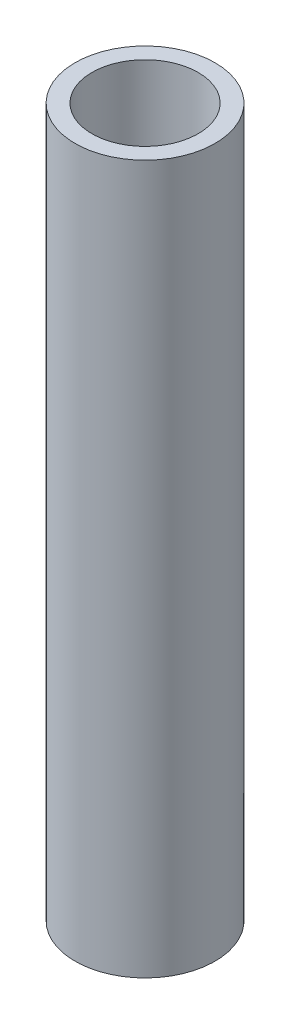
ISO-10303-21;
HEADER;
FILE_DESCRIPTION(('STEP AP214'),'2;1');
FILE_NAME('part.step','',(''),(''),'','','');
FILE_SCHEMA(('AUTOMOTIVE_DESIGN { 1 0 10303 214 1 1 1 1 }'));
ENDSEC;
DATA;
#1=APPLICATION_CONTEXT('core data for automotive mechanical design processes');
#2=APPLICATION_PROTOCOL_DEFINITION('international standard','automotive_design',2000,#1);
#3=PRODUCT_CONTEXT('',#1,'mechanical');
#4=PRODUCT('Part','Part','',(#3));
#5=PRODUCT_RELATED_PRODUCT_CATEGORY('part','',(#4));
#6=PRODUCT_DEFINITION_FORMATION('','',#4);
#7=PRODUCT_DEFINITION_CONTEXT('part definition',#1,'design');
#8=PRODUCT_DEFINITION('design','',#6,#7);
#9=PRODUCT_DEFINITION_SHAPE('','',#8);
#10=(LENGTH_UNIT() NAMED_UNIT(*) SI_UNIT(.MILLI.,.METRE.));
#11=(NAMED_UNIT(*) PLANE_ANGLE_UNIT() SI_UNIT($,.RADIAN.));
#12=(NAMED_UNIT(*) SI_UNIT($,.STERADIAN.) SOLID_ANGLE_UNIT());
#13=UNCERTAINTY_MEASURE_WITH_UNIT(LENGTH_MEASURE(1.E-05),#10,'distance_accuracy_value','');
#14=(GEOMETRIC_REPRESENTATION_CONTEXT(3) GLOBAL_UNCERTAINTY_ASSIGNED_CONTEXT((#13)) GLOBAL_UNIT_ASSIGNED_CONTEXT((#10,
#11,#12)) REPRESENTATION_CONTEXT('',''));
#15=CARTESIAN_POINT('',(0.,0.,0.));
#16=DIRECTION('',(0.,0.,1.));
#17=DIRECTION('',(1.,0.,0.));
#18=AXIS2_PLACEMENT_3D('',#15,#16,#17);
#19=CARTESIAN_POINT('',(0.,42.,0.));
#20=DIRECTION('',(0.,1.,0.));
#21=DIRECTION('',(0.,0.,1.));
#22=AXIS2_PLACEMENT_3D('',#19,#20,#21);
#23=PLANE('',#22);
#24=CARTESIAN_POINT('',(0.,42.,0.));
#25=DIRECTION('',(0.,1.,0.));
#26=DIRECTION('',(0.,0.,1.));
#27=AXIS2_PLACEMENT_3D('',#24,#25,#26);
#28=CIRCLE('',#27,4.15);
#29=CARTESIAN_POINT('',(0.,42.,-4.15));
#30=VERTEX_POINT('',#29);
#31=EDGE_CURVE('E10',#30,#30,#28,.T.);
#32=ORIENTED_EDGE('',*,*,#31,.T.);
#33=EDGE_LOOP('',(#32));
#34=FACE_BOUND('',#33,.T.);
#35=CARTESIAN_POINT('',(0.,42.,0.));
#36=DIRECTION('',(0.,1.,0.));
#37=DIRECTION('',(0.,0.,1.));
#38=AXIS2_PLACEMENT_3D('',#35,#36,#37);
#39=CIRCLE('',#38,3.15);
#40=CARTESIAN_POINT('',(0.,42.,-3.15));
#41=VERTEX_POINT('',#40);
#42=EDGE_CURVE('E56',#41,#41,#39,.T.);
#43=ORIENTED_EDGE('',*,*,#42,.F.);
#44=EDGE_LOOP('',(#43));
#45=FACE_BOUND('',#44,.T.);
#46=ADVANCED_FACE('F43',(#34,#45),#23,.T.);
#47=CARTESIAN_POINT('',(0.,0.,0.));
#48=DIRECTION('',(0.,1.,0.));
#49=DIRECTION('',(0.,0.,1.));
#50=AXIS2_PLACEMENT_3D('',#47,#48,#49);
#51=PLANE('',#50);
#52=CARTESIAN_POINT('',(0.,0.,0.));
#53=DIRECTION('',(0.,1.,0.));
#54=DIRECTION('',(0.,0.,1.));
#55=AXIS2_PLACEMENT_3D('',#52,#53,#54);
#56=CIRCLE('',#55,4.15);
#57=CARTESIAN_POINT('',(0.,0.,-4.15));
#58=VERTEX_POINT('',#57);
#59=EDGE_CURVE('E47',#58,#58,#56,.T.);
#60=ORIENTED_EDGE('',*,*,#59,.F.);
#61=EDGE_LOOP('',(#60));
#62=FACE_BOUND('',#61,.T.);
#63=CARTESIAN_POINT('',(0.,0.,0.));
#64=DIRECTION('',(0.,1.,0.));
#65=DIRECTION('',(0.,0.,1.));
#66=AXIS2_PLACEMENT_3D('',#63,#64,#65);
#67=CIRCLE('',#66,3.15);
#68=CARTESIAN_POINT('',(0.,0.,-3.15));
#69=VERTEX_POINT('',#68);
#70=EDGE_CURVE('E58',#69,#69,#67,.T.);
#71=ORIENTED_EDGE('',*,*,#70,.T.);
#72=EDGE_LOOP('',(#71));
#73=FACE_BOUND('',#72,.T.);
#74=ADVANCED_FACE('F70',(#62,#73),#51,.F.);
#75=CARTESIAN_POINT('',(0.,42.,0.));
#76=DIRECTION('',(0.,-1.,0.));
#77=DIRECTION('',(0.,0.,-1.));
#78=AXIS2_PLACEMENT_3D('',#75,#76,#77);
#79=CYLINDRICAL_SURFACE('',#78,4.15);
#80=CARTESIAN_POINT('',(0.,42.,-4.15));
#81=CARTESIAN_POINT('',(0.,41.5625,-4.15));
#82=CARTESIAN_POINT('',(0.,41.125,-4.15));
#83=CARTESIAN_POINT('',(0.,40.25,-4.15));
#84=CARTESIAN_POINT('',(0.,39.8125,-4.15));
#85=CARTESIAN_POINT('',(0.,38.9375,-4.15));
#86=CARTESIAN_POINT('',(0.,38.5,-4.15));
#87=CARTESIAN_POINT('',(0.,37.625,-4.15));
#88=CARTESIAN_POINT('',(0.,37.1875,-4.15));
#89=CARTESIAN_POINT('',(0.,36.3125,-4.15));
#90=CARTESIAN_POINT('',(0.,35.875,-4.15));
#91=CARTESIAN_POINT('',(0.,35.,-4.15));
#92=CARTESIAN_POINT('',(0.,34.5625,-4.15));
#93=CARTESIAN_POINT('',(0.,33.6875,-4.15));
#94=CARTESIAN_POINT('',(0.,33.25,-4.15));
#95=CARTESIAN_POINT('',(0.,32.375,-4.15));
#96=CARTESIAN_POINT('',(0.,31.9375,-4.15));
#97=CARTESIAN_POINT('',(0.,31.0625,-4.15));
#98=CARTESIAN_POINT('',(0.,30.625,-4.15));
#99=CARTESIAN_POINT('',(0.,29.75,-4.15));
#100=CARTESIAN_POINT('',(0.,29.3125,-4.15));
#101=CARTESIAN_POINT('',(0.,28.4375,-4.15));
#102=CARTESIAN_POINT('',(0.,28.,-4.15));
#103=CARTESIAN_POINT('',(0.,27.125,-4.15));
#104=CARTESIAN_POINT('',(0.,26.6875,-4.15));
#105=CARTESIAN_POINT('',(0.,25.8125,-4.15));
#106=CARTESIAN_POINT('',(0.,25.375,-4.15));
#107=CARTESIAN_POINT('',(0.,24.5,-4.15));
#108=CARTESIAN_POINT('',(0.,24.0625,-4.15));
#109=CARTESIAN_POINT('',(0.,23.1875,-4.15));
#110=CARTESIAN_POINT('',(0.,22.75,-4.15));
#111=CARTESIAN_POINT('',(0.,21.875,-4.15));
#112=CARTESIAN_POINT('',(0.,21.4375,-4.15));
#113=CARTESIAN_POINT('',(0.,20.5625,-4.15));
#114=CARTESIAN_POINT('',(0.,20.125,-4.15));
#115=CARTESIAN_POINT('',(0.,19.25,-4.15));
#116=CARTESIAN_POINT('',(0.,18.8125,-4.15));
#117=CARTESIAN_POINT('',(0.,17.9375,-4.15));
#118=CARTESIAN_POINT('',(0.,17.5,-4.15));
#119=CARTESIAN_POINT('',(0.,16.625,-4.15));
#120=CARTESIAN_POINT('',(0.,16.1875,-4.15));
#121=CARTESIAN_POINT('',(0.,15.3125,-4.15));
#122=CARTESIAN_POINT('',(0.,14.875,-4.15));
#123=CARTESIAN_POINT('',(0.,14.,-4.15));
#124=CARTESIAN_POINT('',(0.,13.5625,-4.15));
#125=CARTESIAN_POINT('',(0.,12.6875,-4.15));
#126=CARTESIAN_POINT('',(0.,12.25,-4.15));
#127=CARTESIAN_POINT('',(0.,11.375,-4.15));
#128=CARTESIAN_POINT('',(0.,10.9375,-4.15));
#129=CARTESIAN_POINT('',(0.,10.0625,-4.15));
#130=CARTESIAN_POINT('',(0.,9.625,-4.15));
#131=CARTESIAN_POINT('',(0.,8.75,-4.15));
#132=CARTESIAN_POINT('',(0.,8.3125,-4.15));
#133=CARTESIAN_POINT('',(0.,7.4375,-4.15));
#134=CARTESIAN_POINT('',(0.,7.,-4.15));
#135=CARTESIAN_POINT('',(0.,6.125,-4.15));
#136=CARTESIAN_POINT('',(0.,5.6875,-4.15));
#137=CARTESIAN_POINT('',(0.,4.8125,-4.15));
#138=CARTESIAN_POINT('',(0.,4.375,-4.15));
#139=CARTESIAN_POINT('',(0.,3.5,-4.15));
#140=CARTESIAN_POINT('',(0.,3.0625,-4.15));
#141=CARTESIAN_POINT('',(0.,2.1875,-4.15));
#142=CARTESIAN_POINT('',(0.,1.75,-4.15));
#143=CARTESIAN_POINT('',(0.,0.875000000000001,-4.15));
#144=CARTESIAN_POINT('',(0.,0.4375,-4.15));
#145=CARTESIAN_POINT('',(0.,0.,-4.15));
#146=B_SPLINE_CURVE_WITH_KNOTS('',3,(#80,#81,#82,#83,#84,#85,#86,#87,#88,#89,#90,#91,#92,#93,
#94,#95,#96,#97,#98,#99,#100,#101,#102,#103,#104,#105,#106,#107,#108,#109,#110,#111,#112,#113,
#114,#115,#116,#117,#118,#119,#120,#121,#122,#123,#124,#125,#126,#127,#128,#129,#130,#131,#132,
#133,#134,#135,#136,#137,#138,#139,#140,#141,#142,#143,#144,#145),.UNSPECIFIED.,.F.,.F.,(4,2,2,
2,2,2,2,2,2,2,2,2,2,2,2,2,2,2,2,2,2,2,2,2,2,2,2,2,2,2,2,2,4),(0.,1.3125,2.625,3.9375,5.25,
6.56250000000001,7.875,9.1875,10.5,11.8125,13.125,14.4375,15.75,17.0625,18.375,19.6875,21.,
22.3125,23.625,24.9375,26.25,27.5625,28.875,30.1875,31.5,32.8125,34.125,35.4375,36.75,38.0625,
39.375,40.6875,42.),.UNSPECIFIED.);
#147=EDGE_CURVE('BSEAM45',#30,#58,#146,.T.);
#148=ORIENTED_EDGE('',*,*,#31,.F.);
#149=ORIENTED_EDGE('',*,*,#59,.T.);
#150=ORIENTED_EDGE('',*,*,#147,.T.);
#151=ORIENTED_EDGE('',*,*,#147,.F.);
#152=EDGE_LOOP('',(#148,#150,#149,#151));
#153=FACE_BOUND('',#152,.T.);
#154=ADVANCED_FACE('F45',(#153),#79,.T.);
#155=CARTESIAN_POINT('',(0.,42.,0.));
#156=DIRECTION('',(0.,-1.,0.));
#157=DIRECTION('',(0.,0.,-1.));
#158=AXIS2_PLACEMENT_3D('',#155,#156,#157);
#159=CYLINDRICAL_SURFACE('',#158,3.15);
#160=CARTESIAN_POINT('',(0.,42.,-3.15));
#161=CARTESIAN_POINT('',(0.,41.5625,-3.15));
#162=CARTESIAN_POINT('',(0.,41.125,-3.15));
#163=CARTESIAN_POINT('',(0.,40.25,-3.15));
#164=CARTESIAN_POINT('',(0.,39.8125,-3.15));
#165=CARTESIAN_POINT('',(0.,38.9375,-3.15));
#166=CARTESIAN_POINT('',(0.,38.5,-3.15));
#167=CARTESIAN_POINT('',(0.,37.625,-3.15));
#168=CARTESIAN_POINT('',(0.,37.1875,-3.15));
#169=CARTESIAN_POINT('',(0.,36.3125,-3.15));
#170=CARTESIAN_POINT('',(0.,35.875,-3.15));
#171=CARTESIAN_POINT('',(0.,35.,-3.15));
#172=CARTESIAN_POINT('',(0.,34.5625,-3.15));
#173=CARTESIAN_POINT('',(0.,33.6875,-3.15));
#174=CARTESIAN_POINT('',(0.,33.25,-3.15));
#175=CARTESIAN_POINT('',(0.,32.375,-3.15));
#176=CARTESIAN_POINT('',(0.,31.9375,-3.15));
#177=CARTESIAN_POINT('',(0.,31.0625,-3.15));
#178=CARTESIAN_POINT('',(0.,30.625,-3.15));
#179=CARTESIAN_POINT('',(0.,29.75,-3.15));
#180=CARTESIAN_POINT('',(0.,29.3125,-3.15));
#181=CARTESIAN_POINT('',(0.,28.4375,-3.15));
#182=CARTESIAN_POINT('',(0.,28.,-3.15));
#183=CARTESIAN_POINT('',(0.,27.125,-3.15));
#184=CARTESIAN_POINT('',(0.,26.6875,-3.15));
#185=CARTESIAN_POINT('',(0.,25.8125,-3.15));
#186=CARTESIAN_POINT('',(0.,25.375,-3.15));
#187=CARTESIAN_POINT('',(0.,24.5,-3.15));
#188=CARTESIAN_POINT('',(0.,24.0625,-3.15));
#189=CARTESIAN_POINT('',(0.,23.1875,-3.15));
#190=CARTESIAN_POINT('',(0.,22.75,-3.15));
#191=CARTESIAN_POINT('',(0.,21.875,-3.15));
#192=CARTESIAN_POINT('',(0.,21.4375,-3.15));
#193=CARTESIAN_POINT('',(0.,20.5625,-3.15));
#194=CARTESIAN_POINT('',(0.,20.125,-3.15));
#195=CARTESIAN_POINT('',(0.,19.25,-3.15));
#196=CARTESIAN_POINT('',(0.,18.8125,-3.15));
#197=CARTESIAN_POINT('',(0.,17.9375,-3.15));
#198=CARTESIAN_POINT('',(0.,17.5,-3.15));
#199=CARTESIAN_POINT('',(0.,16.625,-3.15));
#200=CARTESIAN_POINT('',(0.,16.1875,-3.15));
#201=CARTESIAN_POINT('',(0.,15.3125,-3.15));
#202=CARTESIAN_POINT('',(0.,14.875,-3.15));
#203=CARTESIAN_POINT('',(0.,14.,-3.15));
#204=CARTESIAN_POINT('',(0.,13.5625,-3.15));
#205=CARTESIAN_POINT('',(0.,12.6875,-3.15));
#206=CARTESIAN_POINT('',(0.,12.25,-3.15));
#207=CARTESIAN_POINT('',(0.,11.375,-3.15));
#208=CARTESIAN_POINT('',(0.,10.9375,-3.15));
#209=CARTESIAN_POINT('',(0.,10.0625,-3.15));
#210=CARTESIAN_POINT('',(0.,9.625,-3.15));
#211=CARTESIAN_POINT('',(0.,8.75,-3.15));
#212=CARTESIAN_POINT('',(0.,8.3125,-3.15));
#213=CARTESIAN_POINT('',(0.,7.4375,-3.15));
#214=CARTESIAN_POINT('',(0.,7.,-3.15));
#215=CARTESIAN_POINT('',(0.,6.125,-3.15));
#216=CARTESIAN_POINT('',(0.,5.6875,-3.15));
#217=CARTESIAN_POINT('',(0.,4.8125,-3.15));
#218=CARTESIAN_POINT('',(0.,4.375,-3.15));
#219=CARTESIAN_POINT('',(0.,3.5,-3.15));
#220=CARTESIAN_POINT('',(0.,3.0625,-3.15));
#221=CARTESIAN_POINT('',(0.,2.1875,-3.15));
#222=CARTESIAN_POINT('',(0.,1.75,-3.15));
#223=CARTESIAN_POINT('',(0.,0.875000000000001,-3.15));
#224=CARTESIAN_POINT('',(0.,0.4375,-3.15));
#225=CARTESIAN_POINT('',(0.,0.,-3.15));
#226=B_SPLINE_CURVE_WITH_KNOTS('',3,(#160,#161,#162,#163,#164,#165,#166,#167,#168,#169,#170,
#171,#172,#173,#174,#175,#176,#177,#178,#179,#180,#181,#182,#183,#184,#185,#186,#187,#188,#189,
#190,#191,#192,#193,#194,#195,#196,#197,#198,#199,#200,#201,#202,#203,#204,#205,#206,#207,#208,
#209,#210,#211,#212,#213,#214,#215,#216,#217,#218,#219,#220,#221,#222,#223,#224,#225),
.UNSPECIFIED.,.F.,.F.,(4,2,2,2,2,2,2,2,2,2,2,2,2,2,2,2,2,2,2,2,2,2,2,2,2,2,2,2,2,2,2,2,4),(0.,
1.31249999999999,2.625,3.9375,5.25,6.5625,7.87499999999999,9.18749999999999,10.5,11.8125,13.125,
14.4375,15.75,17.0625,18.375,19.6875,21.,22.3125,23.625,24.9375,26.25,27.5625,28.875,30.1875,
31.5,32.8125,34.125,35.4375,36.75,38.0625,39.375,40.6875,42.),.UNSPECIFIED.);
#227=EDGE_CURVE('BSEAM66',#41,#69,#226,.T.);
#228=ORIENTED_EDGE('',*,*,#42,.T.);
#229=ORIENTED_EDGE('',*,*,#70,.F.);
#230=ORIENTED_EDGE('',*,*,#227,.T.);
#231=ORIENTED_EDGE('',*,*,#227,.F.);
#232=EDGE_LOOP('',(#228,#230,#229,#231));
#233=FACE_BOUND('',#232,.T.);
#234=ADVANCED_FACE('F66',(#233),#159,.F.);
#235=CLOSED_SHELL('',(#46,#74,#154,#234));
#236=MANIFOLD_SOLID_BREP('B2',#235);
#237=ADVANCED_BREP_SHAPE_REPRESENTATION('',(#18,#236),#14);
#238=SHAPE_DEFINITION_REPRESENTATION(#9,#237);
ENDSEC;
END-ISO-10303-21;
